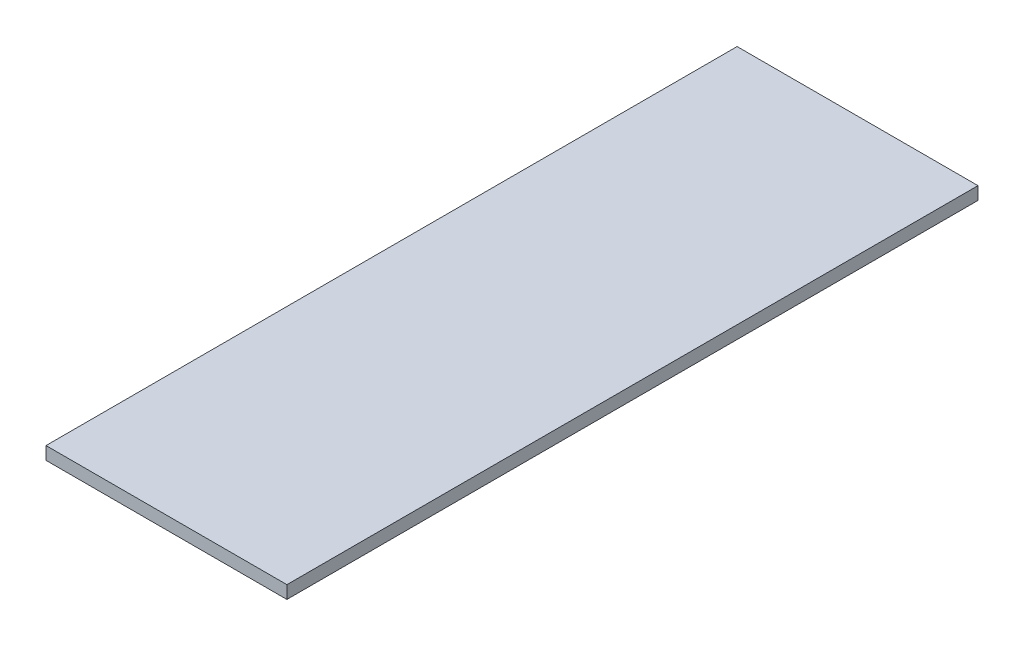
ISO-10303-21;
HEADER;
FILE_DESCRIPTION(('STEP AP214'),'2;1');
FILE_NAME('part.step','',(''),(''),'','','');
FILE_SCHEMA(('AUTOMOTIVE_DESIGN { 1 0 10303 214 1 1 1 1 }'));
ENDSEC;
DATA;
#1=APPLICATION_CONTEXT('core data for automotive mechanical design processes');
#2=APPLICATION_PROTOCOL_DEFINITION('international standard','automotive_design',2000,#1);
#3=PRODUCT_CONTEXT('',#1,'mechanical');
#4=PRODUCT('Part','Part','',(#3));
#5=PRODUCT_RELATED_PRODUCT_CATEGORY('part','',(#4));
#6=PRODUCT_DEFINITION_FORMATION('','',#4);
#7=PRODUCT_DEFINITION_CONTEXT('part definition',#1,'design');
#8=PRODUCT_DEFINITION('design','',#6,#7);
#9=PRODUCT_DEFINITION_SHAPE('','',#8);
#10=(LENGTH_UNIT() NAMED_UNIT(*) SI_UNIT(.MILLI.,.METRE.));
#11=(NAMED_UNIT(*) PLANE_ANGLE_UNIT() SI_UNIT($,.RADIAN.));
#12=(NAMED_UNIT(*) SI_UNIT($,.STERADIAN.) SOLID_ANGLE_UNIT());
#13=UNCERTAINTY_MEASURE_WITH_UNIT(LENGTH_MEASURE(1.E-05),#10,'distance_accuracy_value','');
#14=(GEOMETRIC_REPRESENTATION_CONTEXT(3) GLOBAL_UNCERTAINTY_ASSIGNED_CONTEXT((#13)) GLOBAL_UNIT_ASSIGNED_CONTEXT((#10,
#11,#12)) REPRESENTATION_CONTEXT('',''));
#15=CARTESIAN_POINT('',(0.,0.,0.));
#16=DIRECTION('',(0.,0.,1.));
#17=DIRECTION('',(1.,0.,0.));
#18=AXIS2_PLACEMENT_3D('',#15,#16,#17);
#19=CARTESIAN_POINT('',(0.,6.5,0.));
#20=DIRECTION('',(1.,0.,0.));
#21=DIRECTION('',(0.,0.,-1.));
#22=AXIS2_PLACEMENT_3D('',#19,#20,#21);
#23=PLANE('',#22);
#24=DIRECTION('',(0.,0.,1.));
#25=VECTOR('',#24,1.);
#26=CARTESIAN_POINT('',(0.,0.,0.));
#27=LINE('',#26,#25);
#28=CARTESIAN_POINT('',(0.,0.,-350.));
#29=VERTEX_POINT('',#28);
#30=CARTESIAN_POINT('',(0.,0.,0.));
#31=VERTEX_POINT('',#30);
#32=EDGE_CURVE('E111',#29,#31,#27,.T.);
#33=ORIENTED_EDGE('',*,*,#32,.T.);
#34=DIRECTION('',(0.,-1.,0.));
#35=VECTOR('',#34,1.);
#36=CARTESIAN_POINT('',(0.,6.5,0.));
#37=LINE('',#36,#35);
#38=CARTESIAN_POINT('',(0.,6.5,0.));
#39=VERTEX_POINT('',#38);
#40=EDGE_CURVE('E11',#39,#31,#37,.T.);
#41=ORIENTED_EDGE('',*,*,#40,.F.);
#42=DIRECTION('',(0.,0.,1.));
#43=VECTOR('',#42,1.);
#44=CARTESIAN_POINT('',(0.,6.5,0.));
#45=LINE('',#44,#43);
#46=CARTESIAN_POINT('',(0.,6.5,-350.));
#47=VERTEX_POINT('',#46);
#48=EDGE_CURVE('E95',#47,#39,#45,.T.);
#49=ORIENTED_EDGE('',*,*,#48,.F.);
#50=DIRECTION('',(0.,-1.,0.));
#51=VECTOR('',#50,1.);
#52=CARTESIAN_POINT('',(0.,6.5,-350.));
#53=LINE('',#52,#51);
#54=EDGE_CURVE('E107',#47,#29,#53,.T.);
#55=ORIENTED_EDGE('',*,*,#54,.T.);
#56=EDGE_LOOP('',(#33,#41,#49,#55));
#57=FACE_BOUND('',#56,.T.);
#58=ADVANCED_FACE('F43',(#57),#23,.F.);
#59=CARTESIAN_POINT('',(0.,6.5,0.));
#60=DIRECTION('',(0.,0.,-1.));
#61=DIRECTION('',(-1.,0.,0.));
#62=AXIS2_PLACEMENT_3D('',#59,#60,#61);
#63=PLANE('',#62);
#64=DIRECTION('',(1.,0.,0.));
#65=VECTOR('',#64,1.);
#66=CARTESIAN_POINT('',(0.,0.,0.));
#67=LINE('',#66,#65);
#68=CARTESIAN_POINT('',(122.,0.,0.));
#69=VERTEX_POINT('',#68);
#70=EDGE_CURVE('E100',#31,#69,#67,.T.);
#71=ORIENTED_EDGE('',*,*,#70,.T.);
#72=DIRECTION('',(0.,-1.,0.));
#73=VECTOR('',#72,1.);
#74=CARTESIAN_POINT('',(122.,6.5,0.));
#75=LINE('',#74,#73);
#76=CARTESIAN_POINT('',(122.,6.5,0.));
#77=VERTEX_POINT('',#76);
#78=EDGE_CURVE('E52',#77,#69,#75,.T.);
#79=ORIENTED_EDGE('',*,*,#78,.F.);
#80=DIRECTION('',(1.,0.,0.));
#81=VECTOR('',#80,1.);
#82=CARTESIAN_POINT('',(0.,6.5,0.));
#83=LINE('',#82,#81);
#84=EDGE_CURVE('E90',#39,#77,#83,.T.);
#85=ORIENTED_EDGE('',*,*,#84,.F.);
#86=ORIENTED_EDGE('',*,*,#40,.T.);
#87=EDGE_LOOP('',(#71,#79,#85,#86));
#88=FACE_BOUND('',#87,.T.);
#89=ADVANCED_FACE('F99',(#88),#63,.F.);
#90=CARTESIAN_POINT('',(122.,6.5,0.));
#91=DIRECTION('',(-1.,0.,0.));
#92=DIRECTION('',(0.,0.,1.));
#93=AXIS2_PLACEMENT_3D('',#90,#91,#92);
#94=PLANE('',#93);
#95=DIRECTION('',(0.,0.,-1.));
#96=VECTOR('',#95,1.);
#97=CARTESIAN_POINT('',(122.,0.,0.));
#98=LINE('',#97,#96);
#99=CARTESIAN_POINT('',(122.,0.,-350.));
#100=VERTEX_POINT('',#99);
#101=EDGE_CURVE('E77',#69,#100,#98,.T.);
#102=ORIENTED_EDGE('',*,*,#101,.T.);
#103=DIRECTION('',(0.,-1.,0.));
#104=VECTOR('',#103,1.);
#105=CARTESIAN_POINT('',(122.,6.5,-350.));
#106=LINE('',#105,#104);
#107=CARTESIAN_POINT('',(122.,6.5,-350.));
#108=VERTEX_POINT('',#107);
#109=EDGE_CURVE('E102',#108,#100,#106,.T.);
#110=ORIENTED_EDGE('',*,*,#109,.F.);
#111=DIRECTION('',(0.,0.,-1.));
#112=VECTOR('',#111,1.);
#113=CARTESIAN_POINT('',(122.,6.5,0.));
#114=LINE('',#113,#112);
#115=EDGE_CURVE('E93',#77,#108,#114,.T.);
#116=ORIENTED_EDGE('',*,*,#115,.F.);
#117=ORIENTED_EDGE('',*,*,#78,.T.);
#118=EDGE_LOOP('',(#102,#110,#116,#117));
#119=FACE_BOUND('',#118,.T.);
#120=ADVANCED_FACE('F103',(#119),#94,.F.);
#121=CARTESIAN_POINT('',(0.,6.5,-350.));
#122=DIRECTION('',(0.,0.,1.));
#123=DIRECTION('',(1.,0.,0.));
#124=AXIS2_PLACEMENT_3D('',#121,#122,#123);
#125=PLANE('',#124);
#126=DIRECTION('',(-1.,0.,0.));
#127=VECTOR('',#126,1.);
#128=CARTESIAN_POINT('',(0.,0.,-350.));
#129=LINE('',#128,#127);
#130=EDGE_CURVE('E83',#100,#29,#129,.T.);
#131=ORIENTED_EDGE('',*,*,#130,.T.);
#132=ORIENTED_EDGE('',*,*,#54,.F.);
#133=DIRECTION('',(-1.,0.,0.));
#134=VECTOR('',#133,1.);
#135=CARTESIAN_POINT('',(0.,6.5,-350.));
#136=LINE('',#135,#134);
#137=EDGE_CURVE('E60',#108,#47,#136,.T.);
#138=ORIENTED_EDGE('',*,*,#137,.F.);
#139=ORIENTED_EDGE('',*,*,#109,.T.);
#140=EDGE_LOOP('',(#131,#132,#138,#139));
#141=FACE_BOUND('',#140,.T.);
#142=ADVANCED_FACE('F124',(#141),#125,.F.);
#143=CARTESIAN_POINT('',(0.,6.5,0.));
#144=DIRECTION('',(0.,-1.,0.));
#145=DIRECTION('',(0.,0.,-1.));
#146=AXIS2_PLACEMENT_3D('',#143,#144,#145);
#147=PLANE('',#146);
#148=ORIENTED_EDGE('',*,*,#48,.T.);
#149=ORIENTED_EDGE('',*,*,#84,.T.);
#150=ORIENTED_EDGE('',*,*,#115,.T.);
#151=ORIENTED_EDGE('',*,*,#137,.T.);
#152=EDGE_LOOP('',(#148,#149,#150,#151));
#153=FACE_BOUND('',#152,.T.);
#154=ADVANCED_FACE('F91',(#153),#147,.F.);
#155=CARTESIAN_POINT('',(0.,0.,0.));
#156=DIRECTION('',(0.,-1.,0.));
#157=DIRECTION('',(0.,0.,-1.));
#158=AXIS2_PLACEMENT_3D('',#155,#156,#157);
#159=PLANE('',#158);
#160=ORIENTED_EDGE('',*,*,#32,.F.);
#161=ORIENTED_EDGE('',*,*,#130,.F.);
#162=ORIENTED_EDGE('',*,*,#101,.F.);
#163=ORIENTED_EDGE('',*,*,#70,.F.);
#164=EDGE_LOOP('',(#160,#161,#162,#163));
#165=FACE_BOUND('',#164,.T.);
#166=ADVANCED_FACE('F127',(#165),#159,.T.);
#167=CLOSED_SHELL('',(#58,#89,#120,#142,#154,#166));
#168=MANIFOLD_SOLID_BREP('B2',#167);
#169=ADVANCED_BREP_SHAPE_REPRESENTATION('',(#18,#168),#14);
#170=SHAPE_DEFINITION_REPRESENTATION(#9,#169);
ENDSEC;
END-ISO-10303-21;
